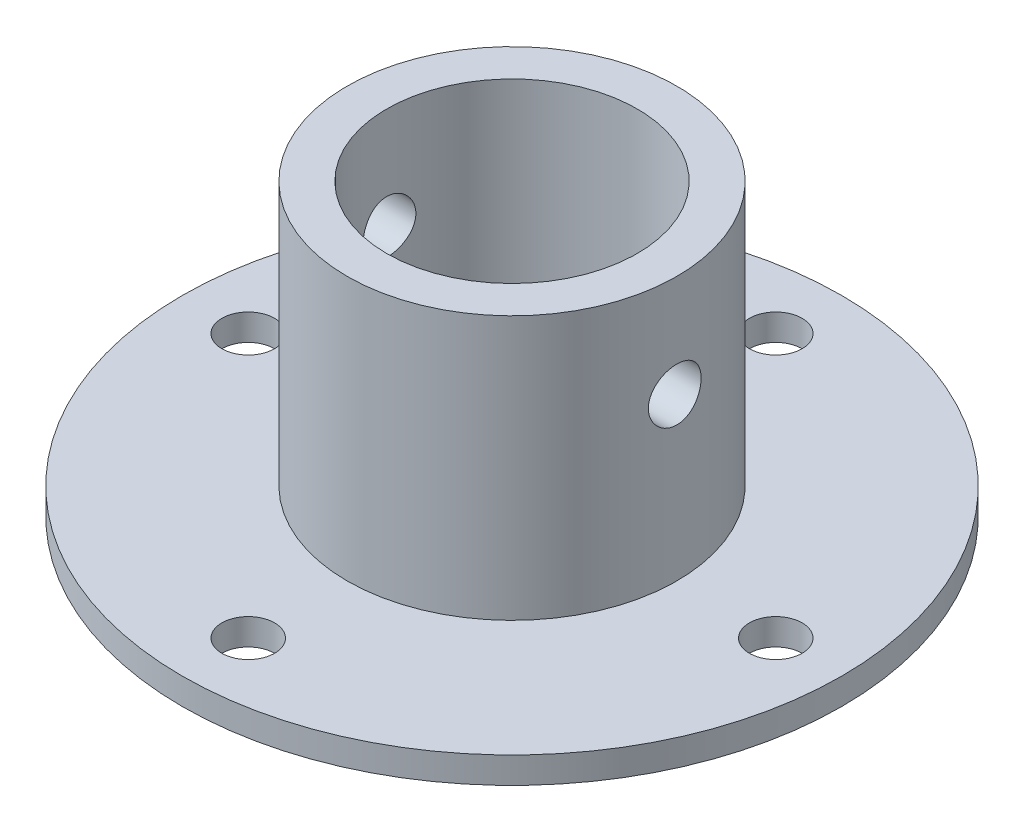
ISO-10303-21;
HEADER;
FILE_DESCRIPTION(('STEP AP214'),'2;1');
FILE_NAME('part.step','',(''),(''),'','','');
FILE_SCHEMA(('AUTOMOTIVE_DESIGN { 1 0 10303 214 1 1 1 1 }'));
ENDSEC;
DATA;
#1=APPLICATION_CONTEXT('core data for automotive mechanical design processes');
#2=APPLICATION_PROTOCOL_DEFINITION('international standard','automotive_design',2000,#1);
#3=PRODUCT_CONTEXT('',#1,'mechanical');
#4=PRODUCT('Part','Part','',(#3));
#5=PRODUCT_RELATED_PRODUCT_CATEGORY('part','',(#4));
#6=PRODUCT_DEFINITION_FORMATION('','',#4);
#7=PRODUCT_DEFINITION_CONTEXT('part definition',#1,'design');
#8=PRODUCT_DEFINITION('design','',#6,#7);
#9=PRODUCT_DEFINITION_SHAPE('','',#8);
#10=(LENGTH_UNIT() NAMED_UNIT(*) SI_UNIT(.MILLI.,.METRE.));
#11=(NAMED_UNIT(*) PLANE_ANGLE_UNIT() SI_UNIT($,.RADIAN.));
#12=(NAMED_UNIT(*) SI_UNIT($,.STERADIAN.) SOLID_ANGLE_UNIT());
#13=UNCERTAINTY_MEASURE_WITH_UNIT(LENGTH_MEASURE(1.E-05),#10,'distance_accuracy_value','');
#14=(GEOMETRIC_REPRESENTATION_CONTEXT(3) GLOBAL_UNCERTAINTY_ASSIGNED_CONTEXT((#13)) GLOBAL_UNIT_ASSIGNED_CONTEXT((#10,
#11,#12)) REPRESENTATION_CONTEXT('',''));
#15=CARTESIAN_POINT('',(0.,0.,0.));
#16=DIRECTION('',(0.,0.,1.));
#17=DIRECTION('',(1.,0.,0.));
#18=AXIS2_PLACEMENT_3D('',#15,#16,#17);
#19=CARTESIAN_POINT('',(0.,2.,0.));
#20=DIRECTION('',(0.,1.,0.));
#21=DIRECTION('',(0.,0.,1.));
#22=AXIS2_PLACEMENT_3D('',#19,#20,#21);
#23=PLANE('',#22);
#24=CARTESIAN_POINT('',(-20.,2.,0.));
#25=DIRECTION('',(0.,1.,0.));
#26=DIRECTION('',(1.,0.,0.));
#27=AXIS2_PLACEMENT_3D('',#24,#25,#26);
#28=CIRCLE('',#27,2.);
#29=CARTESIAN_POINT('',(-18.,2.,0.));
#30=VERTEX_POINT('',#29);
#31=EDGE_CURVE('E143',#30,#30,#28,.T.);
#32=ORIENTED_EDGE('',*,*,#31,.F.);
#33=EDGE_LOOP('',(#32));
#34=FACE_BOUND('',#33,.T.);
#35=CARTESIAN_POINT('',(0.,2.,20.));
#36=DIRECTION('',(0.,1.,0.));
#37=DIRECTION('',(0.,0.,-1.));
#38=AXIS2_PLACEMENT_3D('',#35,#36,#37);
#39=CIRCLE('',#38,2.);
#40=CARTESIAN_POINT('',(0.,2.,18.));
#41=VERTEX_POINT('',#40);
#42=EDGE_CURVE('E138',#41,#41,#39,.T.);
#43=ORIENTED_EDGE('',*,*,#42,.F.);
#44=EDGE_LOOP('',(#43));
#45=FACE_BOUND('',#44,.T.);
#46=CARTESIAN_POINT('',(20.,2.,-2.09488880330588E-13));
#47=DIRECTION('',(0.,1.,0.));
#48=DIRECTION('',(-1.,0.,0.));
#49=AXIS2_PLACEMENT_3D('',#46,#47,#48);
#50=CIRCLE('',#49,2.);
#51=CARTESIAN_POINT('',(18.,2.,-1.88539992297529E-13));
#52=VERTEX_POINT('',#51);
#53=EDGE_CURVE('E139',#52,#52,#50,.T.);
#54=ORIENTED_EDGE('',*,*,#53,.F.);
#55=EDGE_LOOP('',(#54));
#56=FACE_BOUND('',#55,.T.);
#57=CARTESIAN_POINT('',(0.,2.,-20.));
#58=DIRECTION('',(0.,1.,0.));
#59=DIRECTION('',(0.,0.,1.));
#60=AXIS2_PLACEMENT_3D('',#57,#58,#59);
#61=CIRCLE('',#60,2.);
#62=CARTESIAN_POINT('',(0.,2.,-18.));
#63=VERTEX_POINT('',#62);
#64=EDGE_CURVE('E57',#63,#63,#61,.T.);
#65=ORIENTED_EDGE('',*,*,#64,.F.);
#66=EDGE_LOOP('',(#65));
#67=FACE_BOUND('',#66,.T.);
#68=CARTESIAN_POINT('',(0.,2.,0.));
#69=DIRECTION('',(0.,1.,0.));
#70=DIRECTION('',(0.,0.,1.));
#71=AXIS2_PLACEMENT_3D('',#68,#69,#70);
#72=CIRCLE('',#71,25.);
#73=CARTESIAN_POINT('',(0.,2.,25.));
#74=VERTEX_POINT('',#73);
#75=EDGE_CURVE('E10',#74,#74,#72,.T.);
#76=ORIENTED_EDGE('',*,*,#75,.T.);
#77=EDGE_LOOP('',(#76));
#78=FACE_BOUND('',#77,.T.);
#79=CARTESIAN_POINT('',(0.,2.,0.));
#80=DIRECTION('',(0.,1.,0.));
#81=DIRECTION('',(0.,0.,1.));
#82=AXIS2_PLACEMENT_3D('',#79,#80,#81);
#83=CIRCLE('',#82,12.5);
#84=CARTESIAN_POINT('',(0.,2.,12.5));
#85=VERTEX_POINT('',#84);
#86=EDGE_CURVE('E127',#85,#85,#83,.T.);
#87=ORIENTED_EDGE('',*,*,#86,.F.);
#88=EDGE_LOOP('',(#87));
#89=FACE_BOUND('',#88,.T.);
#90=ADVANCED_FACE('F31',(#34,#45,#56,#67,#78,#89),#23,.T.);
#91=CARTESIAN_POINT('',(0.,0.,0.));
#92=DIRECTION('',(0.,1.,0.));
#93=DIRECTION('',(0.,0.,1.));
#94=AXIS2_PLACEMENT_3D('',#91,#92,#93);
#95=PLANE('',#94);
#96=CARTESIAN_POINT('',(-20.,0.,0.));
#97=DIRECTION('',(0.,1.,0.));
#98=DIRECTION('',(1.,0.,0.));
#99=AXIS2_PLACEMENT_3D('',#96,#97,#98);
#100=CIRCLE('',#99,2.);
#101=CARTESIAN_POINT('',(-18.,0.,0.));
#102=VERTEX_POINT('',#101);
#103=EDGE_CURVE('E109',#102,#102,#100,.T.);
#104=ORIENTED_EDGE('',*,*,#103,.T.);
#105=EDGE_LOOP('',(#104));
#106=FACE_BOUND('',#105,.T.);
#107=CARTESIAN_POINT('',(0.,0.,20.));
#108=DIRECTION('',(0.,1.,0.));
#109=DIRECTION('',(0.,0.,-1.));
#110=AXIS2_PLACEMENT_3D('',#107,#108,#109);
#111=CIRCLE('',#110,2.);
#112=CARTESIAN_POINT('',(0.,0.,18.));
#113=VERTEX_POINT('',#112);
#114=EDGE_CURVE('E113',#113,#113,#111,.T.);
#115=ORIENTED_EDGE('',*,*,#114,.T.);
#116=EDGE_LOOP('',(#115));
#117=FACE_BOUND('',#116,.T.);
#118=CARTESIAN_POINT('',(20.,0.,-2.09488880330588E-13));
#119=DIRECTION('',(0.,1.,0.));
#120=DIRECTION('',(-1.,0.,0.));
#121=AXIS2_PLACEMENT_3D('',#118,#119,#120);
#122=CIRCLE('',#121,2.);
#123=CARTESIAN_POINT('',(18.,0.,-1.88539992297529E-13));
#124=VERTEX_POINT('',#123);
#125=EDGE_CURVE('E117',#124,#124,#122,.T.);
#126=ORIENTED_EDGE('',*,*,#125,.T.);
#127=EDGE_LOOP('',(#126));
#128=FACE_BOUND('',#127,.T.);
#129=CARTESIAN_POINT('',(0.,0.,-20.));
#130=DIRECTION('',(0.,1.,0.));
#131=DIRECTION('',(0.,0.,1.));
#132=AXIS2_PLACEMENT_3D('',#129,#130,#131);
#133=CIRCLE('',#132,2.);
#134=CARTESIAN_POINT('',(0.,0.,-18.));
#135=VERTEX_POINT('',#134);
#136=EDGE_CURVE('E54',#135,#135,#133,.T.);
#137=ORIENTED_EDGE('',*,*,#136,.T.);
#138=EDGE_LOOP('',(#137));
#139=FACE_BOUND('',#138,.T.);
#140=CARTESIAN_POINT('',(0.,0.,0.));
#141=DIRECTION('',(0.,1.,0.));
#142=DIRECTION('',(0.,0.,1.));
#143=AXIS2_PLACEMENT_3D('',#140,#141,#142);
#144=CIRCLE('',#143,25.);
#145=CARTESIAN_POINT('',(0.,0.,25.));
#146=VERTEX_POINT('',#145);
#147=EDGE_CURVE('E44',#146,#146,#144,.T.);
#148=ORIENTED_EDGE('',*,*,#147,.F.);
#149=EDGE_LOOP('',(#148));
#150=FACE_BOUND('',#149,.T.);
#151=CARTESIAN_POINT('',(0.,0.,0.));
#152=DIRECTION('',(0.,1.,0.));
#153=DIRECTION('',(0.,0.,1.));
#154=AXIS2_PLACEMENT_3D('',#151,#152,#153);
#155=CIRCLE('',#154,9.5);
#156=CARTESIAN_POINT('',(0.,0.,9.5));
#157=VERTEX_POINT('',#156);
#158=EDGE_CURVE('E49',#157,#157,#155,.T.);
#159=ORIENTED_EDGE('',*,*,#158,.T.);
#160=EDGE_LOOP('',(#159));
#161=FACE_BOUND('',#160,.T.);
#162=ADVANCED_FACE('F98',(#106,#117,#128,#139,#150,#161),#95,.F.);
#163=CARTESIAN_POINT('',(0.,2.,0.));
#164=DIRECTION('',(0.,-1.,0.));
#165=DIRECTION('',(0.,0.,-1.));
#166=AXIS2_PLACEMENT_3D('',#163,#164,#165);
#167=CYLINDRICAL_SURFACE('',#166,25.);
#168=ORIENTED_EDGE('',*,*,#75,.F.);
#169=EDGE_LOOP('',(#168));
#170=FACE_BOUND('',#169,.T.);
#171=ORIENTED_EDGE('',*,*,#147,.T.);
#172=EDGE_LOOP('',(#171));
#173=FACE_BOUND('',#172,.T.);
#174=ADVANCED_FACE('F33',(#170,#173),#167,.T.);
#175=CARTESIAN_POINT('',(0.,2.,0.));
#176=DIRECTION('',(0.,-1.,0.));
#177=DIRECTION('',(0.,0.,-1.));
#178=AXIS2_PLACEMENT_3D('',#175,#176,#177);
#179=CYLINDRICAL_SURFACE('',#178,9.5);
#180=CARTESIAN_POINT('',(-9.28708781050335,14.2455270700643,-2.));
#181=CARTESIAN_POINT('',(-9.28709004628219,14.3565240250321,-1.99999604848787));
#182=CARTESIAN_POINT('',(-9.28909937908883,14.4675694752481,-1.99072834902824));
#183=CARTESIAN_POINT('',(-9.29690617273113,14.6865098644943,-1.95393863409866));
#184=CARTESIAN_POINT('',(-9.30270650302418,14.7944023523263,-1.92640279098501));
#185=CARTESIAN_POINT('',(-9.31740991810553,15.0038379003582,-1.85397609005222));
#186=CARTESIAN_POINT('',(-9.32630974059008,15.1053875046071,-1.80910347426968));
#187=CARTESIAN_POINT('',(-9.34620545074923,15.2995170915094,-1.7033282235525));
#188=CARTESIAN_POINT('',(-9.35720126235131,15.3920973995136,-1.64242617036495));
#189=CARTESIAN_POINT('',(-9.38024234347676,15.5671128721082,-1.50530439177798));
#190=CARTESIAN_POINT('',(-9.39230019123638,15.6493871537912,-1.42888140265771));
#191=CARTESIAN_POINT('',(-9.41599635067121,15.8000480986008,-1.26332609209004));
#192=CARTESIAN_POINT('',(-9.42763463114851,15.8684337307493,-1.17419282797262));
#193=CARTESIAN_POINT('',(-9.44931673722959,15.9900071596058,-0.984674376392206));
#194=CARTESIAN_POINT('',(-9.4593439948354,16.0430410417204,-0.884188396563355));
#195=CARTESIAN_POINT('',(-9.47653252407335,16.1314109229945,-0.675484795669488));
#196=CARTESIAN_POINT('',(-9.4836940932778,16.1667487598022,-0.567267978748517));
#197=CARTESIAN_POINT('',(-9.49425545534837,16.218219743988,-0.347846036008976));
#198=CARTESIAN_POINT('',(-9.49770848039411,16.2346249124346,-0.236707324826064));
#199=CARTESIAN_POINT('',(-9.50064786364403,16.2486145658641,-0.0132051123854757));
#200=CARTESIAN_POINT('',(-9.50013464357649,16.2462010518249,0.0991582573863628));
#201=CARTESIAN_POINT('',(-9.49524029898523,16.2228261165144,0.320047679053735));
#202=CARTESIAN_POINT('',(-9.49092030201756,16.2021578106776,0.428606301711606));
#203=CARTESIAN_POINT('',(-9.47896712250148,16.1433261053091,0.640679021827894));
#204=CARTESIAN_POINT('',(-9.47133379760883,16.1051619541326,0.744192902346072));
#205=CARTESIAN_POINT('',(-9.45351224173596,16.0121571493779,0.944061522506241));
#206=CARTESIAN_POINT('',(-9.44330681774517,15.9572037223704,1.04036218955075));
#207=CARTESIAN_POINT('',(-9.42146280046143,15.83226408841,1.22248275831773));
#208=CARTESIAN_POINT('',(-9.40982402551375,15.7622759752082,1.3083013288483));
#209=CARTESIAN_POINT('',(-9.38613072324991,15.6076523435736,1.46876329697693));
#210=CARTESIAN_POINT('',(-9.37407250702203,15.5227602780977,1.54315914177499));
#211=CARTESIAN_POINT('',(-9.35111090453841,15.3415814109196,1.67670206801193));
#212=CARTESIAN_POINT('',(-9.34020754511678,15.2452943445545,1.7358487951699));
#213=CARTESIAN_POINT('',(-9.32078149698534,15.043678596742,1.83731339767347));
#214=CARTESIAN_POINT('',(-9.31226501615453,14.9383272527973,1.87958750888871));
#215=CARTESIAN_POINT('',(-9.29866512008386,14.7217951097757,1.94575946786074));
#216=CARTESIAN_POINT('',(-9.2935812042722,14.6106151632348,1.96965999511226));
#217=CARTESIAN_POINT('',(-9.28752335798651,14.3878355914741,1.99802865644981));
#218=CARTESIAN_POINT('',(-9.28647348271892,14.2762837096795,2.00285591352628));
#219=CARTESIAN_POINT('',(-9.28839817637478,14.0539689730884,1.99391064101408));
#220=CARTESIAN_POINT('',(-9.29137249065704,13.9432060688131,1.98013928830147));
#221=CARTESIAN_POINT('',(-9.30093898330961,13.7268443812117,1.93469842503013));
#222=CARTESIAN_POINT('',(-9.30749169477901,13.6212027093708,1.90322405334428));
#223=CARTESIAN_POINT('',(-9.3234415006778,13.4166922100995,1.82348069481082));
#224=CARTESIAN_POINT('',(-9.33283885062072,13.3178239920587,1.77521019922931));
#225=CARTESIAN_POINT('',(-9.35358763018115,13.1281050210145,1.66244389822715));
#226=CARTESIAN_POINT('',(-9.36496515398555,13.0373896022344,1.59772530294085));
#227=CARTESIAN_POINT('',(-9.3883222729422,12.867975206971,1.45419387760045));
#228=CARTESIAN_POINT('',(-9.40030193698601,12.789277609639,1.37537943217288));
#229=CARTESIAN_POINT('',(-9.42376214796692,12.6447533769552,1.20427422366582));
#230=CARTESIAN_POINT('',(-9.43523060826274,12.5791706816962,1.11177548384634));
#231=CARTESIAN_POINT('',(-9.45615945157325,12.4644759704232,0.916864851897607));
#232=CARTESIAN_POINT('',(-9.46561992441647,12.4153632175593,0.814453403517885));
#233=CARTESIAN_POINT('',(-9.48141559299094,12.3353493804535,0.603236849515162));
#234=CARTESIAN_POINT('',(-9.48776967094203,12.3043380374126,0.494474988160275));
#235=CARTESIAN_POINT('',(-9.4967179724302,12.2610606060702,0.27313749393954));
#236=CARTESIAN_POINT('',(-9.49931270029477,12.2487920033649,0.160562374707104));
#237=CARTESIAN_POINT('',(-9.50043633718011,12.2434543676028,-0.0628839753092422));
#238=CARTESIAN_POINT('',(-9.49904261190113,12.250020004865,-0.173746249878782));
#239=CARTESIAN_POINT('',(-9.49251031027347,12.2813520273955,-0.392749650055908));
#240=CARTESIAN_POINT('',(-9.48737179184874,12.3061181311416,-0.500890817726431));
#241=CARTESIAN_POINT('',(-9.47393142103355,12.3729785611409,-0.71112423871422));
#242=CARTESIAN_POINT('',(-9.46563838837061,12.4150246004328,-0.813232448267791));
#243=CARTESIAN_POINT('',(-9.44677781465251,12.5152028616106,-1.00899513608219));
#244=CARTESIAN_POINT('',(-9.43621007076024,12.5733365181691,-1.10264885939459));
#245=CARTESIAN_POINT('',(-9.41372230018547,12.7052495192886,-1.28063720637341));
#246=CARTESIAN_POINT('',(-9.40178163275772,12.7792878036155,-1.36477733307987));
#247=CARTESIAN_POINT('',(-9.37800998504355,12.9403816282427,-1.519564324803));
#248=CARTESIAN_POINT('',(-9.36617903164606,13.027440274496,-1.59020796110607));
#249=CARTESIAN_POINT('',(-9.34380655671436,13.2133779427594,-1.71682094415387));
#250=CARTESIAN_POINT('',(-9.33328250045813,13.3123880513894,-1.77260102752215));
#251=CARTESIAN_POINT('',(-9.31493203835597,13.5185740577012,-1.86664264117731));
#252=CARTESIAN_POINT('',(-9.30710327676031,13.6257427240451,-1.90491947935911));
#253=CARTESIAN_POINT('',(-9.29652930127854,13.8184897702446,-1.95576882435574));
#254=CARTESIAN_POINT('',(-9.29301153387582,13.9029975087255,-1.97232467609379));
#255=CARTESIAN_POINT('',(-9.28828997058716,14.0735028531701,-1.99444156473289));
#256=CARTESIAN_POINT('',(-9.28708607769352,14.1595003965222,-2.00000306256549));
#257=CARTESIAN_POINT('',(-9.28708781050335,14.2455270700643,-2.));
#258=B_SPLINE_CURVE_WITH_KNOTS('',3,(#180,#181,#182,#183,#184,#185,#186,#187,#188,#189,#190,
#191,#192,#193,#194,#195,#196,#197,#198,#199,#200,#201,#202,#203,#204,#205,#206,#207,#208,#209,
#210,#211,#212,#213,#214,#215,#216,#217,#218,#219,#220,#221,#222,#223,#224,#225,#226,#227,#228,
#229,#230,#231,#232,#233,#234,#235,#236,#237,#238,#239,#240,#241,#242,#243,#244,#245,#246,#247,
#248,#249,#250,#251,#252,#253,#254,#255,#256,#257),.UNSPECIFIED.,.T.,.F.,(4,2,2,2,2,2,2,2,2,2,2,
2,2,2,2,2,2,2,2,2,2,2,2,2,2,2,2,2,2,2,2,2,2,2,2,2,2,2,4),(0.,0.332675720034058,
0.665603538903749,0.998181995545641,1.33074838377397,1.66798910536293,2.00525485176212,
2.34579332468104,2.68629642699646,3.02184382391206,3.3573555427809,3.68757597677536,
4.01781059880938,4.35031407759778,4.68285973942978,5.02182136111628,5.36079085714757,
5.70063394463758,6.04042746201683,6.37379176148539,6.7071349674375,7.03687380782472,
7.36664227508609,7.70114062330744,8.03567732937095,8.37595255086766,8.7162125467381,
9.05437772891384,9.39249754106857,9.7241034146695,10.0557041591458,10.3863845135479,
10.7170943671025,11.0536632320287,11.3903125124891,11.7310632155782,12.0715153340735,
12.3293619162638,12.5871976881646),.UNSPECIFIED.);
#259=CARTESIAN_POINT('',(-9.28708781050335,14.2455270700643,-2.));
#260=VERTEX_POINT('',#259);
#261=EDGE_CURVE('E85',#260,#260,#258,.T.);
#262=ORIENTED_EDGE('',*,*,#261,.F.);
#263=EDGE_LOOP('',(#262));
#264=FACE_BOUND('',#263,.T.);
#265=CARTESIAN_POINT('',(9.28708781050335,14.2455270700643,-2.));
#266=CARTESIAN_POINT('',(9.28709004628219,14.1345301150966,-1.99999604848787));
#267=CARTESIAN_POINT('',(9.28909937908883,14.0234846648806,-1.99072834902824));
#268=CARTESIAN_POINT('',(9.29690617273113,13.8045442756343,-1.95393863409866));
#269=CARTESIAN_POINT('',(9.30270650302418,13.6966517878023,-1.92640279098501));
#270=CARTESIAN_POINT('',(9.31740991810553,13.4872162397704,-1.85397609005222));
#271=CARTESIAN_POINT('',(9.32630974059008,13.3856666355216,-1.80910347426968));
#272=CARTESIAN_POINT('',(9.34620545074923,13.1915370486192,-1.7033282235525));
#273=CARTESIAN_POINT('',(9.35720126235131,13.0989567406151,-1.64242617036495));
#274=CARTESIAN_POINT('',(9.38024234347676,12.9239412680204,-1.50530439177798));
#275=CARTESIAN_POINT('',(9.39230019123638,12.8416669863374,-1.42888140265771));
#276=CARTESIAN_POINT('',(9.4159963506712,12.6910060415279,-1.26332609209004));
#277=CARTESIAN_POINT('',(9.42763463114851,12.6226204093794,-1.17419282797262));
#278=CARTESIAN_POINT('',(9.44931673722958,12.5010469805228,-0.984674376392207));
#279=CARTESIAN_POINT('',(9.45934399483539,12.4480130984082,-0.884188396563356));
#280=CARTESIAN_POINT('',(9.47653252407335,12.3596432171342,-0.675484795669489));
#281=CARTESIAN_POINT('',(9.4836940932778,12.3243053803264,-0.567267978748517));
#282=CARTESIAN_POINT('',(9.49425545534837,12.2728343961407,-0.347846036008977));
#283=CARTESIAN_POINT('',(9.49770848039411,12.256429227694,-0.236707324826064));
#284=CARTESIAN_POINT('',(9.50064786364403,12.2424395742646,-0.0132051123854759));
#285=CARTESIAN_POINT('',(9.50013464357649,12.2448530883037,0.0991582573863629));
#286=CARTESIAN_POINT('',(9.49524029898523,12.2682280236143,0.320047679053735));
#287=CARTESIAN_POINT('',(9.49092030201756,12.2888963294511,0.428606301711605));
#288=CARTESIAN_POINT('',(9.47896712250148,12.3477280348195,0.640679021827893));
#289=CARTESIAN_POINT('',(9.47133379760883,12.385892185996,0.744192902346072));
#290=CARTESIAN_POINT('',(9.45351224173596,12.4788969907508,0.944061522506242));
#291=CARTESIAN_POINT('',(9.44330681774517,12.5338504177582,1.04036218955075));
#292=CARTESIAN_POINT('',(9.42146280046143,12.6587900517187,1.22248275831773));
#293=CARTESIAN_POINT('',(9.40982402551375,12.7287781649204,1.3083013288483));
#294=CARTESIAN_POINT('',(9.38613072324991,12.8834017965551,1.46876329697693));
#295=CARTESIAN_POINT('',(9.37407250702203,12.9682938620309,1.54315914177499));
#296=CARTESIAN_POINT('',(9.35111090453841,13.149472729209,1.67670206801193));
#297=CARTESIAN_POINT('',(9.34020754511678,13.2457597955741,1.7358487951699));
#298=CARTESIAN_POINT('',(9.32078149698533,13.4473755433867,1.83731339767347));
#299=CARTESIAN_POINT('',(9.31226501615453,13.5527268873314,1.87958750888871));
#300=CARTESIAN_POINT('',(9.29866512008386,13.7692590303529,1.94575946786074));
#301=CARTESIAN_POINT('',(9.2935812042722,13.8804389768938,1.96965999511226));
#302=CARTESIAN_POINT('',(9.28752335798651,14.1032185486546,1.99802865644981));
#303=CARTESIAN_POINT('',(9.28647348271892,14.2147704304492,2.00285591352628));
#304=CARTESIAN_POINT('',(9.28839817637478,14.4370851670403,1.99391064101408));
#305=CARTESIAN_POINT('',(9.29137249065704,14.5478480713156,1.98013928830147));
#306=CARTESIAN_POINT('',(9.30093898330961,14.764209758917,1.93469842503013));
#307=CARTESIAN_POINT('',(9.30749169477901,14.8698514307578,1.90322405334428));
#308=CARTESIAN_POINT('',(9.3234415006778,15.0743619300291,1.82348069481082));
#309=CARTESIAN_POINT('',(9.33283885062072,15.1732301480699,1.77521019922931));
#310=CARTESIAN_POINT('',(9.35358763018115,15.3629491191142,1.66244389822715));
#311=CARTESIAN_POINT('',(9.36496515398555,15.4536645378942,1.59772530294085));
#312=CARTESIAN_POINT('',(9.3883222729422,15.6230789331576,1.45419387760045));
#313=CARTESIAN_POINT('',(9.40030193698601,15.7017765304896,1.37537943217288));
#314=CARTESIAN_POINT('',(9.42376214796691,15.8463007631735,1.20427422366582));
#315=CARTESIAN_POINT('',(9.43523060826274,15.9118834584324,1.11177548384634));
#316=CARTESIAN_POINT('',(9.45615945157325,16.0265781697054,0.916864851897608));
#317=CARTESIAN_POINT('',(9.46561992441647,16.0756909225693,0.814453403517886));
#318=CARTESIAN_POINT('',(9.48141559299094,16.1557047596752,0.603236849515163));
#319=CARTESIAN_POINT('',(9.48776967094203,16.1867161027161,0.494474988160275));
#320=CARTESIAN_POINT('',(9.4967179724302,16.2299935340584,0.273137493939541));
#321=CARTESIAN_POINT('',(9.49931270029477,16.2422621367637,0.160562374707105));
#322=CARTESIAN_POINT('',(9.50043633718011,16.2475997725258,-0.0628839753092411));
#323=CARTESIAN_POINT('',(9.49904261190113,16.2410341352636,-0.173746249878781));
#324=CARTESIAN_POINT('',(9.49251031027347,16.2097021127331,-0.392749650055907));
#325=CARTESIAN_POINT('',(9.48737179184874,16.184936008987,-0.500890817726429));
#326=CARTESIAN_POINT('',(9.47393142103355,16.1180755789878,-0.711124238714219));
#327=CARTESIAN_POINT('',(9.46563838837061,16.0760295396958,-0.81323244826779));
#328=CARTESIAN_POINT('',(9.44677781465251,15.9758512785181,-1.00899513608218));
#329=CARTESIAN_POINT('',(9.43621007076024,15.9177176219595,-1.10264885939459));
#330=CARTESIAN_POINT('',(9.41372230018547,15.78580462084,-1.28063720637341));
#331=CARTESIAN_POINT('',(9.40178163275772,15.7117663365131,-1.36477733307987));
#332=CARTESIAN_POINT('',(9.37800998504355,15.5506725118859,-1.519564324803));
#333=CARTESIAN_POINT('',(9.36617903164606,15.4636138656326,-1.59020796110607));
#334=CARTESIAN_POINT('',(9.34380655671436,15.2776761973693,-1.71682094415387));
#335=CARTESIAN_POINT('',(9.33328250045813,15.1786660887392,-1.77260102752215));
#336=CARTESIAN_POINT('',(9.31493203835597,14.9724800824274,-1.8666426411773));
#337=CARTESIAN_POINT('',(9.30710327676031,14.8653114160836,-1.90491947935911));
#338=CARTESIAN_POINT('',(9.29652930127854,14.6725643698841,-1.95576882435574));
#339=CARTESIAN_POINT('',(9.29301153387582,14.5880566314032,-1.97232467609379));
#340=CARTESIAN_POINT('',(9.28828997058716,14.4175512869585,-1.99444156473289));
#341=CARTESIAN_POINT('',(9.28708607769352,14.3315537436064,-2.00000306256549));
#342=CARTESIAN_POINT('',(9.28708781050335,14.2455270700643,-2.));
#343=B_SPLINE_CURVE_WITH_KNOTS('',3,(#265,#266,#267,#268,#269,#270,#271,#272,#273,#274,#275,
#276,#277,#278,#279,#280,#281,#282,#283,#284,#285,#286,#287,#288,#289,#290,#291,#292,#293,#294,
#295,#296,#297,#298,#299,#300,#301,#302,#303,#304,#305,#306,#307,#308,#309,#310,#311,#312,#313,
#314,#315,#316,#317,#318,#319,#320,#321,#322,#323,#324,#325,#326,#327,#328,#329,#330,#331,#332,
#333,#334,#335,#336,#337,#338,#339,#340,#341,#342),.UNSPECIFIED.,.T.,.F.,(4,2,2,2,2,2,2,2,2,2,2,
2,2,2,2,2,2,2,2,2,2,2,2,2,2,2,2,2,2,2,2,2,2,2,2,2,2,2,4),(0.,0.332675720034058,
0.665603538903749,0.99818199554564,1.33074838377397,1.66798910536293,2.00525485176212,
2.34579332468104,2.68629642699646,3.02184382391206,3.3573555427809,3.68757597677536,
4.01781059880938,4.35031407759778,4.68285973942978,5.02182136111628,5.36079085714757,
5.70063394463758,6.04042746201683,6.37379176148539,6.7071349674375,7.03687380782472,
7.36664227508608,7.70114062330744,8.03567732937094,8.37595255086766,8.7162125467381,
9.05437772891384,9.39249754106856,9.7241034146695,10.0557041591458,10.3863845135479,
10.7170943671025,11.0536632320287,11.3903125124891,11.7310632155782,12.0715153340735,
12.3293619162638,12.5871976881646),.UNSPECIFIED.);
#344=CARTESIAN_POINT('',(9.28708781050335,14.2455270700643,-2.));
#345=VERTEX_POINT('',#344);
#346=EDGE_CURVE('E80',#345,#345,#343,.T.);
#347=ORIENTED_EDGE('',*,*,#346,.F.);
#348=EDGE_LOOP('',(#347));
#349=FACE_BOUND('',#348,.T.);
#350=ORIENTED_EDGE('',*,*,#158,.F.);
#351=EDGE_LOOP('',(#350));
#352=FACE_BOUND('',#351,.T.);
#353=CARTESIAN_POINT('',(0.,22.,0.));
#354=DIRECTION('',(0.,1.,0.));
#355=DIRECTION('',(0.,0.,1.));
#356=AXIS2_PLACEMENT_3D('',#353,#354,#355);
#357=CIRCLE('',#356,9.5);
#358=CARTESIAN_POINT('',(0.,22.,9.5));
#359=VERTEX_POINT('',#358);
#360=EDGE_CURVE('E56',#359,#359,#357,.T.);
#361=ORIENTED_EDGE('',*,*,#360,.T.);
#362=EDGE_LOOP('',(#361));
#363=FACE_BOUND('',#362,.T.);
#364=ADVANCED_FACE('F90',(#264,#349,#352,#363),#179,.F.);
#365=CARTESIAN_POINT('',(0.,22.,0.));
#366=DIRECTION('',(0.,1.,0.));
#367=DIRECTION('',(0.,0.,1.));
#368=AXIS2_PLACEMENT_3D('',#365,#366,#367);
#369=PLANE('',#368);
#370=CARTESIAN_POINT('',(0.,22.,0.));
#371=DIRECTION('',(0.,1.,0.));
#372=DIRECTION('',(0.,0.,1.));
#373=AXIS2_PLACEMENT_3D('',#370,#371,#372);
#374=CIRCLE('',#373,12.5);
#375=CARTESIAN_POINT('',(0.,22.,12.5));
#376=VERTEX_POINT('',#375);
#377=EDGE_CURVE('E125',#376,#376,#374,.T.);
#378=ORIENTED_EDGE('',*,*,#377,.T.);
#379=EDGE_LOOP('',(#378));
#380=FACE_BOUND('',#379,.T.);
#381=ORIENTED_EDGE('',*,*,#360,.F.);
#382=EDGE_LOOP('',(#381));
#383=FACE_BOUND('',#382,.T.);
#384=ADVANCED_FACE('F94',(#380,#383),#369,.T.);
#385=CARTESIAN_POINT('',(0.,22.,0.));
#386=DIRECTION('',(0.,-1.,0.));
#387=DIRECTION('',(0.,0.,-1.));
#388=AXIS2_PLACEMENT_3D('',#385,#386,#387);
#389=CYLINDRICAL_SURFACE('',#388,12.5);
#390=CARTESIAN_POINT('',(-12.3389626792531,14.2455270700643,-2.));
#391=CARTESIAN_POINT('',(-12.3389646365747,14.3570937854339,-1.99999546268269));
#392=CARTESIAN_POINT('',(-12.3404922170901,14.4687230109407,-1.99063305520351));
#393=CARTESIAN_POINT('',(-12.3464325117521,14.688853917409,-1.95344445500885));
#394=CARTESIAN_POINT('',(-12.3508479497636,14.7973525445689,-1.92560083019994));
#395=CARTESIAN_POINT('',(-12.3620513503607,15.0080043831656,-1.85230972937127));
#396=CARTESIAN_POINT('',(-12.3688373965941,15.1101626417096,-1.8068764692589));
#397=CARTESIAN_POINT('',(-12.3840151290006,15.3053935504528,-1.69973041648431));
#398=CARTESIAN_POINT('',(-12.3924066178675,15.3984673150002,-1.63801962395043));
#399=CARTESIAN_POINT('',(-12.409935008592,15.5737460028596,-1.4994714023648));
#400=CARTESIAN_POINT('',(-12.4190774196954,15.6558563355741,-1.42251498707585));
#401=CARTESIAN_POINT('',(-12.4370285016078,15.8060565297245,-1.25591709815232));
#402=CARTESIAN_POINT('',(-12.4458371532121,15.8741455853651,-1.16627489597169));
#403=CARTESIAN_POINT('',(-12.4621862608068,15.994723031356,-0.97623991702932));
#404=CARTESIAN_POINT('',(-12.4697194921289,16.0471237604024,-0.875790844473847));
#405=CARTESIAN_POINT('',(-12.4826077762261,16.1342740091243,-0.667375995890961));
#406=CARTESIAN_POINT('',(-12.4879629596488,16.169024587555,-0.559410671172467));
#407=CARTESIAN_POINT('',(-12.4958528816707,16.2195998144268,-0.34000412894607));
#408=CARTESIAN_POINT('',(-12.49841126176,16.2355831894694,-0.228600363359409));
#409=CARTESIAN_POINT('',(-12.500500461766,16.24866357815,-0.004664807522254));
#410=CARTESIAN_POINT('',(-12.5000314720312,16.2457617792093,0.107866911363008));
#411=CARTESIAN_POINT('',(-12.4961375614702,16.2212785843793,0.329779715978529));
#412=CARTESIAN_POINT('',(-12.4927396690852,16.199867985817,0.439180187321413));
#413=CARTESIAN_POINT('',(-12.4833998597574,16.1392435554397,0.652815342747672));
#414=CARTESIAN_POINT('',(-12.4774578701704,16.1000292152549,0.757049879228179));
#415=CARTESIAN_POINT('',(-12.4636513003451,16.0047386113642,0.957905986409037));
#416=CARTESIAN_POINT('',(-12.4557786507463,15.9485913426685,1.05449329349384));
#417=CARTESIAN_POINT('',(-12.4389865614945,15.8210806414473,1.23693967157033));
#418=CARTESIAN_POINT('',(-12.4300670436423,15.7497160718935,1.32279794013346));
#419=CARTESIAN_POINT('',(-12.4120565702159,15.5928475065041,1.48235721573536));
#420=CARTESIAN_POINT('',(-12.4029648129688,15.5071942942234,1.555911508216));
#421=CARTESIAN_POINT('',(-12.3857313850728,15.3246843137924,1.68762680827441));
#422=CARTESIAN_POINT('',(-12.3775897219101,15.2278274573749,1.74578769456446));
#423=CARTESIAN_POINT('',(-12.3631781549851,15.0254965601073,1.84509031627292));
#424=CARTESIAN_POINT('',(-12.3569100782548,14.920014234908,1.88621545421919));
#425=CARTESIAN_POINT('',(-12.3469864391895,14.703516448421,1.95012354011945));
#426=CARTESIAN_POINT('',(-12.343330665898,14.5925014347,1.9729079691951));
#427=CARTESIAN_POINT('',(-12.3390860491727,14.3693992473909,1.99928349997629));
#428=CARTESIAN_POINT('',(-12.338463865144,14.25733735538,2.0030832637492));
#429=CARTESIAN_POINT('',(-12.3402681873056,14.0341781037987,1.99193667548245));
#430=CARTESIAN_POINT('',(-12.3426945853421,13.9230807101518,1.97699098847046));
#431=CARTESIAN_POINT('',(-12.3502919469979,13.7056601646199,1.92895527704861));
#432=CARTESIAN_POINT('',(-12.3554469800096,13.5993131468836,1.89597053344241));
#433=CARTESIAN_POINT('',(-12.3679074973821,13.3936566830476,1.81290306911356));
#434=CARTESIAN_POINT('',(-12.3752131012361,13.2943476283825,1.76281939829005));
#435=CARTESIAN_POINT('',(-12.3912295180301,13.1046546769829,1.64647965217412));
#436=CARTESIAN_POINT('',(-12.3999517832886,13.0143541164943,1.58008930093855));
#437=CARTESIAN_POINT('',(-12.4177848415153,12.8461010094276,1.43320604247695));
#438=CARTESIAN_POINT('',(-12.426895659562,12.7681492614243,1.35271222391417));
#439=CARTESIAN_POINT('',(-12.4445842082074,12.6260497779715,1.17898475488122));
#440=CARTESIAN_POINT('',(-12.4531560233311,12.5620408409535,1.08563688229299));
#441=CARTESIAN_POINT('',(-12.4687070996718,12.4506140240758,0.889391847388559));
#442=CARTESIAN_POINT('',(-12.4756864092145,12.4031956407415,0.786494974976327));
#443=CARTESIAN_POINT('',(-12.4872402999743,12.3265143460456,0.574493777094341));
#444=CARTESIAN_POINT('',(-12.4918246669271,12.2971774638283,0.465416763098581));
#445=CARTESIAN_POINT('',(-12.4981133908354,12.2572532336718,0.243805255219829));
#446=CARTESIAN_POINT('',(-12.4998179654206,12.2466644689103,0.131271023257733));
#447=CARTESIAN_POINT('',(-12.5001523384762,12.244575271985,-0.0927181607457094));
#448=CARTESIAN_POINT('',(-12.4988162330541,12.2528631706614,-0.204171144782973));
#449=CARTESIAN_POINT('',(-12.4932886224694,12.2878359083362,-0.42407633113722));
#450=CARTESIAN_POINT('',(-12.4890971303321,12.3145206634149,-0.532528547140253));
#451=CARTESIAN_POINT('',(-12.4783277894448,12.3854508948922,-0.743282123112944));
#452=CARTESIAN_POINT('',(-12.471752200968,12.4296797421124,-0.845589202324673));
#453=CARTESIAN_POINT('',(-12.4569342995937,12.5344195304432,-1.04136319830549));
#454=CARTESIAN_POINT('',(-12.4486919178104,12.5949311445265,-1.13482974947654));
#455=CARTESIAN_POINT('',(-12.4313454639236,12.7312753904487,-1.31133889146831));
#456=CARTESIAN_POINT('',(-12.4222331866072,12.8072635730508,-1.39426053318836));
#457=CARTESIAN_POINT('',(-12.4042323453373,12.972076938928,-1.54625119082762));
#458=CARTESIAN_POINT('',(-12.3953438343009,13.0609051257855,-1.61531695647598));
#459=CARTESIAN_POINT('',(-12.3787350502446,13.2495562439833,-1.73804191736152));
#460=CARTESIAN_POINT('',(-12.3710226983478,13.3494465203208,-1.79159866107389));
#461=CARTESIAN_POINT('',(-12.35773272045,13.5568853597277,-1.88109182389773));
#462=CARTESIAN_POINT('',(-12.3521529288763,13.6644260216055,-1.91704612842095));
#463=CARTESIAN_POINT('',(-12.3450187006154,13.851265028185,-1.96235985662764));
#464=CARTESIAN_POINT('',(-12.3427600761638,13.9294223635358,-1.97645270113688));
#465=CARTESIAN_POINT('',(-12.339731381368,14.0868849646249,-1.99527431170452));
#466=CARTESIAN_POINT('',(-12.3389612873707,14.1661902121024,-2.00000322655819));
#467=CARTESIAN_POINT('',(-12.3389626792531,14.2455270700643,-2.));
#468=B_SPLINE_CURVE_WITH_KNOTS('',3,(#390,#391,#392,#393,#394,#395,#396,#397,#398,#399,#400,
#401,#402,#403,#404,#405,#406,#407,#408,#409,#410,#411,#412,#413,#414,#415,#416,#417,#418,#419,
#420,#421,#422,#423,#424,#425,#426,#427,#428,#429,#430,#431,#432,#433,#434,#435,#436,#437,#438,
#439,#440,#441,#442,#443,#444,#445,#446,#447,#448,#449,#450,#451,#452,#453,#454,#455,#456,#457,
#458,#459,#460,#461,#462,#463,#464,#465,#466,#467),.UNSPECIFIED.,.T.,.F.,(4,2,2,2,2,2,2,2,2,2,2,
2,2,2,2,2,2,2,2,2,2,2,2,2,2,2,2,2,2,2,2,2,2,2,2,2,2,2,4),(0.,0.334410082462097,
0.669136040632829,1.00359203680448,1.33800695527948,1.6751426933581,2.01229780104021,
2.35130309503299,2.69028805118043,3.02638485112864,3.36246051891023,3.69546762348862,
4.0284842373816,4.36291718178071,4.69737512358616,5.03557384337791,5.37377522782556,
5.71230534220323,6.05080811551122,6.3855820633356,6.72034413480418,7.05317297710997,
7.38602031604107,7.7217061792982,8.05741374188326,8.39632425403564,8.73522448035856,
9.07272891067331,9.41020783420237,9.74392117047707,10.0776329844847,10.4110292424998,
10.7444392820194,11.0813822106389,11.4184040861632,11.7576040091322,12.0964585602663,
12.3342666441618,12.5720709491951),.UNSPECIFIED.);
#469=CARTESIAN_POINT('',(-12.3389626792531,14.2455270700643,-2.));
#470=VERTEX_POINT('',#469);
#471=EDGE_CURVE('E35',#470,#470,#468,.T.);
#472=ORIENTED_EDGE('',*,*,#471,.T.);
#473=EDGE_LOOP('',(#472));
#474=FACE_BOUND('',#473,.T.);
#475=CARTESIAN_POINT('',(12.3389626792531,14.2455270700643,-2.));
#476=CARTESIAN_POINT('',(12.3389646365747,14.1339603546947,-1.99999546268269));
#477=CARTESIAN_POINT('',(12.3404922170901,14.0223311291879,-1.99063305520352));
#478=CARTESIAN_POINT('',(12.3464325117521,13.8022002227197,-1.95344445500885));
#479=CARTESIAN_POINT('',(12.3508479497636,13.6937015955597,-1.92560083019994));
#480=CARTESIAN_POINT('',(12.3620513503607,13.4830497569631,-1.85230972937127));
#481=CARTESIAN_POINT('',(12.3688373965941,13.3808914984191,-1.8068764692589));
#482=CARTESIAN_POINT('',(12.3840151290006,13.1856605896759,-1.69973041648431));
#483=CARTESIAN_POINT('',(12.3924066178675,13.0925868251284,-1.63801962395043));
#484=CARTESIAN_POINT('',(12.409935008592,12.917308137269,-1.4994714023648));
#485=CARTESIAN_POINT('',(12.4190774196954,12.8351978045545,-1.42251498707585));
#486=CARTESIAN_POINT('',(12.4370285016078,12.6849976104042,-1.25591709815232));
#487=CARTESIAN_POINT('',(12.4458371532121,12.6169085547636,-1.16627489597169));
#488=CARTESIAN_POINT('',(12.4621862608068,12.4963311087726,-0.976239917029319));
#489=CARTESIAN_POINT('',(12.4697194921289,12.4439303797262,-0.875790844473846));
#490=CARTESIAN_POINT('',(12.4826077762261,12.3567801310043,-0.667375995890961));
#491=CARTESIAN_POINT('',(12.4879629596488,12.3220295525736,-0.559410671172467));
#492=CARTESIAN_POINT('',(12.4958528816707,12.2714543257019,-0.34000412894607));
#493=CARTESIAN_POINT('',(12.49841126176,12.2554709506592,-0.228600363359409));
#494=CARTESIAN_POINT('',(12.500500461766,12.2423905619786,-0.00466480752225393));
#495=CARTESIAN_POINT('',(12.5000314720312,12.2452923609194,0.107866911363008));
#496=CARTESIAN_POINT('',(12.4961375614702,12.2697755557493,0.329779715978529));
#497=CARTESIAN_POINT('',(12.4927396690852,12.2911861543116,0.439180187321413));
#498=CARTESIAN_POINT('',(12.4833998597574,12.351810584689,0.652815342747672));
#499=CARTESIAN_POINT('',(12.4774578701704,12.3910249248737,0.757049879228179));
#500=CARTESIAN_POINT('',(12.4636513003451,12.4863155287644,0.957905986409037));
#501=CARTESIAN_POINT('',(12.4557786507463,12.5424627974601,1.05449329349384));
#502=CARTESIAN_POINT('',(12.4389865614945,12.6699734986813,1.23693967157033));
#503=CARTESIAN_POINT('',(12.4300670436423,12.7413380682351,1.32279794013346));
#504=CARTESIAN_POINT('',(12.4120565702159,12.8982066336246,1.48235721573536));
#505=CARTESIAN_POINT('',(12.4029648129688,12.9838598459052,1.555911508216));
#506=CARTESIAN_POINT('',(12.3857313850728,13.1663698263363,1.68762680827441));
#507=CARTESIAN_POINT('',(12.3775897219101,13.2632266827537,1.74578769456446));
#508=CARTESIAN_POINT('',(12.3631781549851,13.4655575800213,1.84509031627292));
#509=CARTESIAN_POINT('',(12.3569100782548,13.5710399052207,1.88621545421919));
#510=CARTESIAN_POINT('',(12.3469864391895,13.7875376917076,1.95012354011945));
#511=CARTESIAN_POINT('',(12.343330665898,13.8985527054287,1.9729079691951));
#512=CARTESIAN_POINT('',(12.3390860491727,14.1216548927378,1.99928349997629));
#513=CARTESIAN_POINT('',(12.338463865144,14.2337167847487,2.0030832637492));
#514=CARTESIAN_POINT('',(12.3402681873056,14.45687603633,1.99193667548245));
#515=CARTESIAN_POINT('',(12.3426945853421,14.5679734299768,1.97699098847046));
#516=CARTESIAN_POINT('',(12.3502919469979,14.7853939755087,1.92895527704861));
#517=CARTESIAN_POINT('',(12.3554469800096,14.8917409932451,1.89597053344241));
#518=CARTESIAN_POINT('',(12.3679074973821,15.097397457081,1.81290306911356));
#519=CARTESIAN_POINT('',(12.3752131012361,15.1967065117462,1.76281939829005));
#520=CARTESIAN_POINT('',(12.3912295180301,15.3863994631458,1.64647965217412));
#521=CARTESIAN_POINT('',(12.3999517832886,15.4767000236344,1.58008930093855));
#522=CARTESIAN_POINT('',(12.4177848415153,15.6449531307011,1.43320604247695));
#523=CARTESIAN_POINT('',(12.426895659562,15.7229048787044,1.35271222391417));
#524=CARTESIAN_POINT('',(12.4445842082074,15.8650043621572,1.17898475488122));
#525=CARTESIAN_POINT('',(12.4531560233311,15.9290132991751,1.08563688229299));
#526=CARTESIAN_POINT('',(12.4687070996718,16.0404401160528,0.889391847388558));
#527=CARTESIAN_POINT('',(12.4756864092145,16.0878584993871,0.786494974976326));
#528=CARTESIAN_POINT('',(12.4872402999743,16.164539794083,0.574493777094341));
#529=CARTESIAN_POINT('',(12.491824666927,16.1938766763003,0.46541676309858));
#530=CARTESIAN_POINT('',(12.4981133908354,16.2338009064568,0.243805255219828));
#531=CARTESIAN_POINT('',(12.4998179654206,16.2443896712183,0.131271023257732));
#532=CARTESIAN_POINT('',(12.5001523384762,16.2464788681436,-0.0927181607457099));
#533=CARTESIAN_POINT('',(12.4988162330541,16.2381909694672,-0.204171144782973));
#534=CARTESIAN_POINT('',(12.4932886224694,16.2032182317925,-0.42407633113722));
#535=CARTESIAN_POINT('',(12.4890971303321,16.1765334767137,-0.532528547140254));
#536=CARTESIAN_POINT('',(12.4783277894448,16.1056032452365,-0.743282123112944));
#537=CARTESIAN_POINT('',(12.471752200968,16.0613743980163,-0.845589202324673));
#538=CARTESIAN_POINT('',(12.4569342995937,15.9566346096854,-1.0413631983055));
#539=CARTESIAN_POINT('',(12.4486919178105,15.8961229956021,-1.13482974947654));
#540=CARTESIAN_POINT('',(12.4313454639236,15.7597787496799,-1.31133889146831));
#541=CARTESIAN_POINT('',(12.4222331866072,15.6837905670778,-1.39426053318836));
#542=CARTESIAN_POINT('',(12.4042323453373,15.5189772012007,-1.54625119082762));
#543=CARTESIAN_POINT('',(12.3953438343009,15.4301490143431,-1.61531695647598));
#544=CARTESIAN_POINT('',(12.3787350502446,15.2414978961453,-1.73804191736152));
#545=CARTESIAN_POINT('',(12.3710226983478,15.1416076198079,-1.79159866107389));
#546=CARTESIAN_POINT('',(12.35773272045,14.934168780401,-1.88109182389773));
#547=CARTESIAN_POINT('',(12.3521529288763,14.8266281185231,-1.91704612842095));
#548=CARTESIAN_POINT('',(12.3450187006154,14.6397891119437,-1.96235985662764));
#549=CARTESIAN_POINT('',(12.3427600761638,14.5616317765928,-1.97645270113688));
#550=CARTESIAN_POINT('',(12.339731381368,14.4041691755037,-1.99527431170452));
#551=CARTESIAN_POINT('',(12.3389612873707,14.3248639280262,-2.00000322655819));
#552=CARTESIAN_POINT('',(12.3389626792531,14.2455270700643,-2.));
#553=B_SPLINE_CURVE_WITH_KNOTS('',3,(#475,#476,#477,#478,#479,#480,#481,#482,#483,#484,#485,
#486,#487,#488,#489,#490,#491,#492,#493,#494,#495,#496,#497,#498,#499,#500,#501,#502,#503,#504,
#505,#506,#507,#508,#509,#510,#511,#512,#513,#514,#515,#516,#517,#518,#519,#520,#521,#522,#523,
#524,#525,#526,#527,#528,#529,#530,#531,#532,#533,#534,#535,#536,#537,#538,#539,#540,#541,#542,
#543,#544,#545,#546,#547,#548,#549,#550,#551,#552),.UNSPECIFIED.,.T.,.F.,(4,2,2,2,2,2,2,2,2,2,2,
2,2,2,2,2,2,2,2,2,2,2,2,2,2,2,2,2,2,2,2,2,2,2,2,2,2,2,4),(0.,0.334410082462097,
0.669136040632829,1.00359203680448,1.33800695527948,1.6751426933581,2.01229780104021,
2.35130309503299,2.69028805118043,3.02638485112864,3.36246051891023,3.69546762348862,
4.0284842373816,4.36291718178071,4.69737512358616,5.03557384337791,5.37377522782556,
5.71230534220323,6.05080811551122,6.3855820633356,6.72034413480418,7.05317297710996,
7.38602031604106,7.7217061792982,8.05741374188326,8.39632425403564,8.73522448035855,
9.07272891067331,9.41020783420237,9.74392117047707,10.0776329844847,10.4110292424998,
10.7444392820194,11.0813822106389,11.4184040861632,11.7576040091322,12.0964585602663,
12.3342666441618,12.5720709491951),.UNSPECIFIED.);
#554=CARTESIAN_POINT('',(12.3389626792531,14.2455270700643,-2.));
#555=VERTEX_POINT('',#554);
#556=EDGE_CURVE('E58',#555,#555,#553,.T.);
#557=ORIENTED_EDGE('',*,*,#556,.T.);
#558=EDGE_LOOP('',(#557));
#559=FACE_BOUND('',#558,.T.);
#560=ORIENTED_EDGE('',*,*,#377,.F.);
#561=EDGE_LOOP('',(#560));
#562=FACE_BOUND('',#561,.T.);
#563=ORIENTED_EDGE('',*,*,#86,.T.);
#564=EDGE_LOOP('',(#563));
#565=FACE_BOUND('',#564,.T.);
#566=ADVANCED_FACE('F63',(#474,#559,#562,#565),#389,.T.);
#567=CARTESIAN_POINT('',(0.,-23.,-20.));
#568=DIRECTION('',(0.,1.,0.));
#569=DIRECTION('',(0.,0.,1.));
#570=AXIS2_PLACEMENT_3D('',#567,#568,#569);
#571=CYLINDRICAL_SURFACE('',#570,2.);
#572=ORIENTED_EDGE('',*,*,#64,.T.);
#573=EDGE_LOOP('',(#572));
#574=FACE_BOUND('',#573,.T.);
#575=ORIENTED_EDGE('',*,*,#136,.F.);
#576=EDGE_LOOP('',(#575));
#577=FACE_BOUND('',#576,.T.);
#578=ADVANCED_FACE('F160',(#574,#577),#571,.F.);
#579=CARTESIAN_POINT('',(20.,-23.,-2.09488880330588E-13));
#580=DIRECTION('',(0.,1.,0.));
#581=DIRECTION('',(-1.,0.,0.));
#582=AXIS2_PLACEMENT_3D('',#579,#580,#581);
#583=CYLINDRICAL_SURFACE('',#582,2.);
#584=ORIENTED_EDGE('',*,*,#53,.T.);
#585=EDGE_LOOP('',(#584));
#586=FACE_BOUND('',#585,.T.);
#587=ORIENTED_EDGE('',*,*,#125,.F.);
#588=EDGE_LOOP('',(#587));
#589=FACE_BOUND('',#588,.T.);
#590=ADVANCED_FACE('F166',(#586,#589),#583,.F.);
#591=CARTESIAN_POINT('',(0.,-23.,20.));
#592=DIRECTION('',(0.,1.,0.));
#593=DIRECTION('',(0.,0.,-1.));
#594=AXIS2_PLACEMENT_3D('',#591,#592,#593);
#595=CYLINDRICAL_SURFACE('',#594,2.);
#596=ORIENTED_EDGE('',*,*,#42,.T.);
#597=EDGE_LOOP('',(#596));
#598=FACE_BOUND('',#597,.T.);
#599=ORIENTED_EDGE('',*,*,#114,.F.);
#600=EDGE_LOOP('',(#599));
#601=FACE_BOUND('',#600,.T.);
#602=ADVANCED_FACE('F180',(#598,#601),#595,.F.);
#603=CARTESIAN_POINT('',(-20.,-23.,0.));
#604=DIRECTION('',(0.,1.,0.));
#605=DIRECTION('',(1.,0.,0.));
#606=AXIS2_PLACEMENT_3D('',#603,#604,#605);
#607=CYLINDRICAL_SURFACE('',#606,2.);
#608=ORIENTED_EDGE('',*,*,#31,.T.);
#609=EDGE_LOOP('',(#608));
#610=FACE_BOUND('',#609,.T.);
#611=ORIENTED_EDGE('',*,*,#103,.F.);
#612=EDGE_LOOP('',(#611));
#613=FACE_BOUND('',#612,.T.);
#614=ADVANCED_FACE('F73',(#610,#613),#607,.F.);
#615=CARTESIAN_POINT('',(-25.,14.2455270700643,0.));
#616=DIRECTION('',(1.,0.,0.));
#617=DIRECTION('',(0.,0.,-1.));
#618=AXIS2_PLACEMENT_3D('',#615,#616,#617);
#619=CYLINDRICAL_SURFACE('',#618,2.);
#620=ORIENTED_EDGE('',*,*,#346,.T.);
#621=EDGE_LOOP('',(#620));
#622=FACE_BOUND('',#621,.T.);
#623=ORIENTED_EDGE('',*,*,#556,.F.);
#624=EDGE_LOOP('',(#623));
#625=FACE_BOUND('',#624,.T.);
#626=ADVANCED_FACE('F71',(#622,#625),#619,.F.);
#627=ORIENTED_EDGE('',*,*,#261,.T.);
#628=EDGE_LOOP('',(#627));
#629=FACE_BOUND('',#628,.T.);
#630=ORIENTED_EDGE('',*,*,#471,.F.);
#631=EDGE_LOOP('',(#630));
#632=FACE_BOUND('',#631,.T.);
#633=ADVANCED_FACE('F67',(#629,#632),#619,.F.);
#634=CLOSED_SHELL('',(#90,#162,#174,#364,#384,#566,#578,#590,#602,#614,#626,#633));
#635=MANIFOLD_SOLID_BREP('B2',#634);
#636=ADVANCED_BREP_SHAPE_REPRESENTATION('',(#18,#635),#14);
#637=SHAPE_DEFINITION_REPRESENTATION(#9,#636);
ENDSEC;
END-ISO-10303-21;
